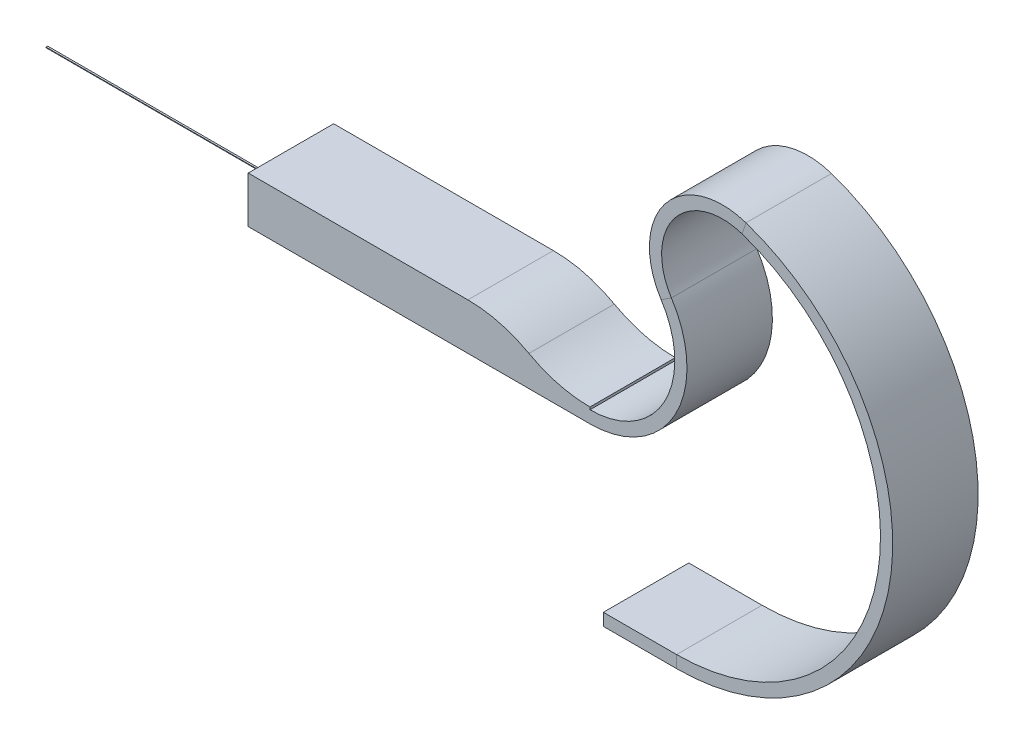
ISO-10303-21;
HEADER;
FILE_DESCRIPTION(('STEP AP214'),'2;1');
FILE_NAME('part.step','',(''),(''),'','','');
FILE_SCHEMA(('AUTOMOTIVE_DESIGN { 1 0 10303 214 1 1 1 1 }'));
ENDSEC;
DATA;
#1=APPLICATION_CONTEXT('core data for automotive mechanical design processes');
#2=APPLICATION_PROTOCOL_DEFINITION('international standard','automotive_design',2000,#1);
#3=PRODUCT_CONTEXT('',#1,'mechanical');
#4=PRODUCT('Part','Part','',(#3));
#5=PRODUCT_RELATED_PRODUCT_CATEGORY('part','',(#4));
#6=PRODUCT_DEFINITION_FORMATION('','',#4);
#7=PRODUCT_DEFINITION_CONTEXT('part definition',#1,'design');
#8=PRODUCT_DEFINITION('design','',#6,#7);
#9=PRODUCT_DEFINITION_SHAPE('','',#8);
#10=(LENGTH_UNIT() NAMED_UNIT(*) SI_UNIT(.MILLI.,.METRE.));
#11=(NAMED_UNIT(*) PLANE_ANGLE_UNIT() SI_UNIT($,.RADIAN.));
#12=(NAMED_UNIT(*) SI_UNIT($,.STERADIAN.) SOLID_ANGLE_UNIT());
#13=UNCERTAINTY_MEASURE_WITH_UNIT(LENGTH_MEASURE(1.E-05),#10,'distance_accuracy_value','');
#14=(GEOMETRIC_REPRESENTATION_CONTEXT(3) GLOBAL_UNCERTAINTY_ASSIGNED_CONTEXT((#13)) GLOBAL_UNIT_ASSIGNED_CONTEXT((#10,
#11,#12)) REPRESENTATION_CONTEXT('',''));
#15=CARTESIAN_POINT('',(0.,0.,0.));
#16=DIRECTION('',(0.,0.,1.));
#17=DIRECTION('',(1.,0.,0.));
#18=AXIS2_PLACEMENT_3D('',#15,#16,#17);
#19=CARTESIAN_POINT('',(7.,1.9,1.75));
#20=DIRECTION('',(-1.,0.,0.));
#21=DIRECTION('',(0.,0.,1.));
#22=AXIS2_PLACEMENT_3D('',#19,#20,#21);
#23=PLANE('',#22);
#24=DIRECTION('',(0.,0.,1.));
#25=VECTOR('',#24,1.);
#26=CARTESIAN_POINT('',(7.,0.5,-1.75));
#27=LINE('',#26,#25);
#28=CARTESIAN_POINT('',(7.,0.5,-1.75));
#29=VERTEX_POINT('',#28);
#30=CARTESIAN_POINT('',(7.,0.5,1.75));
#31=VERTEX_POINT('',#30);
#32=EDGE_CURVE('E53',#29,#31,#27,.T.);
#33=ORIENTED_EDGE('',*,*,#32,.F.);
#34=DIRECTION('',(0.,-1.,0.));
#35=VECTOR('',#34,1.);
#36=CARTESIAN_POINT('',(7.,1.9,-1.75));
#37=LINE('',#36,#35);
#38=CARTESIAN_POINT('',(7.,0.6,-1.75));
#39=VERTEX_POINT('',#38);
#40=EDGE_CURVE('E11',#39,#29,#37,.T.);
#41=ORIENTED_EDGE('',*,*,#40,.F.);
#42=DIRECTION('',(0.,0.,1.));
#43=VECTOR('',#42,1.);
#44=CARTESIAN_POINT('',(7.,0.6,-1.75));
#45=LINE('',#44,#43);
#46=CARTESIAN_POINT('',(7.,0.6,1.75));
#47=VERTEX_POINT('',#46);
#48=EDGE_CURVE('E319',#39,#47,#45,.T.);
#49=ORIENTED_EDGE('',*,*,#48,.T.);
#50=DIRECTION('',(0.,-1.,0.));
#51=VECTOR('',#50,1.);
#52=CARTESIAN_POINT('',(7.,1.9,1.75));
#53=LINE('',#52,#51);
#54=EDGE_CURVE('E334',#47,#31,#53,.T.);
#55=ORIENTED_EDGE('',*,*,#54,.T.);
#56=EDGE_LOOP('',(#33,#41,#49,#55));
#57=FACE_BOUND('',#56,.T.);
#58=ADVANCED_FACE('F39',(#57),#23,.F.);
#59=CARTESIAN_POINT('',(-7.,1.9,1.75));
#60=DIRECTION('',(1.,0.,0.));
#61=DIRECTION('',(0.,0.,-1.));
#62=AXIS2_PLACEMENT_3D('',#59,#60,#61);
#63=PLANE('',#62);
#64=DIRECTION('',(0.,0.,1.));
#65=VECTOR('',#64,1.);
#66=CARTESIAN_POINT('',(-7.,0.,1.75));
#67=LINE('',#66,#65);
#68=CARTESIAN_POINT('',(-7.,0.,-1.75));
#69=VERTEX_POINT('',#68);
#70=CARTESIAN_POINT('',(-7.,0.,1.75));
#71=VERTEX_POINT('',#70);
#72=EDGE_CURVE('E338',#69,#71,#67,.T.);
#73=ORIENTED_EDGE('',*,*,#72,.T.);
#74=DIRECTION('',(0.,-1.,0.));
#75=VECTOR('',#74,1.);
#76=CARTESIAN_POINT('',(-7.,1.9,1.75));
#77=LINE('',#76,#75);
#78=CARTESIAN_POINT('',(-7.,1.9,1.75));
#79=VERTEX_POINT('',#78);
#80=EDGE_CURVE('E342',#79,#71,#77,.T.);
#81=ORIENTED_EDGE('',*,*,#80,.F.);
#82=DIRECTION('',(0.,0.,1.));
#83=VECTOR('',#82,1.);
#84=CARTESIAN_POINT('',(-7.,1.9,1.75));
#85=LINE('',#84,#83);
#86=CARTESIAN_POINT('',(-7.,1.9,-1.75));
#87=VERTEX_POINT('',#86);
#88=EDGE_CURVE('E328',#87,#79,#85,.T.);
#89=ORIENTED_EDGE('',*,*,#88,.F.);
#90=DIRECTION('',(0.,-1.,0.));
#91=VECTOR('',#90,1.);
#92=CARTESIAN_POINT('',(-7.,1.9,-1.75));
#93=LINE('',#92,#91);
#94=EDGE_CURVE('E46',#87,#69,#93,.T.);
#95=ORIENTED_EDGE('',*,*,#94,.T.);
#96=EDGE_LOOP('',(#73,#81,#89,#95));
#97=FACE_BOUND('',#96,.T.);
#98=DIRECTION('',(0.,1.,0.));
#99=VECTOR('',#98,1.);
#100=CARTESIAN_POINT('',(-7.,0.488,0.0349999999999996));
#101=LINE('',#100,#99);
#102=CARTESIAN_POINT('',(-7.,0.488,0.0349999999999996));
#103=VERTEX_POINT('',#102);
#104=CARTESIAN_POINT('',(-7.,0.512,0.0349999999999997));
#105=VERTEX_POINT('',#104);
#106=EDGE_CURVE('E279',#103,#105,#101,.T.);
#107=ORIENTED_EDGE('',*,*,#106,.F.);
#108=DIRECTION('',(0.,0.,1.));
#109=VECTOR('',#108,1.);
#110=CARTESIAN_POINT('',(-7.,0.488,-0.0350000000000004));
#111=LINE('',#110,#109);
#112=CARTESIAN_POINT('',(-7.,0.488,-0.0350000000000005));
#113=VERTEX_POINT('',#112);
#114=EDGE_CURVE('E284',#113,#103,#111,.T.);
#115=ORIENTED_EDGE('',*,*,#114,.F.);
#116=DIRECTION('',(0.,-1.,0.));
#117=VECTOR('',#116,1.);
#118=CARTESIAN_POINT('',(-7.,0.488,-0.0350000000000004));
#119=LINE('',#118,#117);
#120=CARTESIAN_POINT('',(-7.,0.512,-0.0350000000000004));
#121=VERTEX_POINT('',#120);
#122=EDGE_CURVE('E294',#121,#113,#119,.T.);
#123=ORIENTED_EDGE('',*,*,#122,.F.);
#124=DIRECTION('',(0.,0.,-1.));
#125=VECTOR('',#124,1.);
#126=CARTESIAN_POINT('',(-7.,0.512,-0.0350000000000004));
#127=LINE('',#126,#125);
#128=EDGE_CURVE('E60',#105,#121,#127,.T.);
#129=ORIENTED_EDGE('',*,*,#128,.F.);
#130=EDGE_LOOP('',(#107,#115,#123,#129));
#131=FACE_BOUND('',#130,.T.);
#132=ADVANCED_FACE('F349',(#97,#131),#63,.F.);
#133=CARTESIAN_POINT('',(-7.,1.9,-1.75));
#134=DIRECTION('',(0.,0.,1.));
#135=DIRECTION('',(1.,0.,0.));
#136=AXIS2_PLACEMENT_3D('',#133,#134,#135);
#137=PLANE('',#136);
#138=CARTESIAN_POINT('',(2.,-3.23269230769231,-1.75));
#139=DIRECTION('',(0.,0.,-1.));
#140=DIRECTION('',(-1.,0.,0.));
#141=AXIS2_PLACEMENT_3D('',#138,#139,#140);
#142=CIRCLE('',#141,5.13269230769231);
#143=CARTESIAN_POINT('',(2.,1.9,-1.75));
#144=VERTEX_POINT('',#143);
#145=CARTESIAN_POINT('',(4.5,1.25,-1.75));
#146=VERTEX_POINT('',#145);
#147=EDGE_CURVE('E317',#144,#146,#142,.T.);
#148=ORIENTED_EDGE('',*,*,#147,.T.);
#149=CARTESIAN_POINT('',(7.,5.73269230769231,-1.75));
#150=DIRECTION('',(0.,0.,1.));
#151=DIRECTION('',(1.,0.,0.));
#152=AXIS2_PLACEMENT_3D('',#149,#150,#151);
#153=CIRCLE('',#152,5.13269230769231);
#154=EDGE_CURVE('E314',#146,#39,#153,.T.);
#155=ORIENTED_EDGE('',*,*,#154,.T.);
#156=ORIENTED_EDGE('',*,*,#40,.T.);
#157=CARTESIAN_POINT('',(7.,3.97544201821203,-1.75));
#158=DIRECTION('',(0.,0.,1.));
#159=DIRECTION('',(0.,-1.,0.));
#160=AXIS2_PLACEMENT_3D('',#157,#158,#159);
#161=CIRCLE('',#160,3.47544201821203);
#162=CARTESIAN_POINT('',(9.91698375260048,5.86486071427136,-1.75));
#163=VERTEX_POINT('',#162);
#164=EDGE_CURVE('E199',#29,#163,#161,.T.);
#165=ORIENTED_EDGE('',*,*,#164,.T.);
#166=DIRECTION('',(-0.8393130247361,-0.543648458572576,0.));
#167=VECTOR('',#166,1.);
#168=CARTESIAN_POINT('',(10.3366402649685,6.13668494355765,-1.75));
#169=LINE('',#168,#167);
#170=CARTESIAN_POINT('',(10.3366402649685,6.13668494355765,-1.75));
#171=VERTEX_POINT('',#170);
#172=EDGE_CURVE('E175',#171,#163,#169,.T.);
#173=ORIENTED_EDGE('',*,*,#172,.F.);
#174=CARTESIAN_POINT('',(7.,3.97544201821203,-1.75));
#175=DIRECTION('',(0.,0.,1.));
#176=DIRECTION('',(0.,-1.,0.));
#177=AXIS2_PLACEMENT_3D('',#174,#175,#176);
#178=CIRCLE('',#177,3.97544201821203);
#179=CARTESIAN_POINT('',(7.,0.,-1.75));
#180=VERTEX_POINT('',#179);
#181=EDGE_CURVE('E197',#180,#171,#178,.T.);
#182=ORIENTED_EDGE('',*,*,#181,.F.);
#183=DIRECTION('',(-1.,0.,0.));
#184=VECTOR('',#183,1.);
#185=CARTESIAN_POINT('',(-7.,0.,-1.75));
#186=LINE('',#185,#184);
#187=EDGE_CURVE('E336',#180,#69,#186,.T.);
#188=ORIENTED_EDGE('',*,*,#187,.T.);
#189=ORIENTED_EDGE('',*,*,#94,.F.);
#190=DIRECTION('',(-1.,0.,0.));
#191=VECTOR('',#190,1.);
#192=CARTESIAN_POINT('',(-7.,1.9,-1.75));
#193=LINE('',#192,#191);
#194=EDGE_CURVE('E326',#144,#87,#193,.T.);
#195=ORIENTED_EDGE('',*,*,#194,.F.);
#196=EDGE_LOOP('',(#148,#155,#156,#165,#173,#182,#188,#189,#195));
#197=FACE_BOUND('',#196,.T.);
#198=ADVANCED_FACE('F196',(#197),#137,.F.);
#199=CARTESIAN_POINT('',(-7.,1.9,1.75));
#200=DIRECTION('',(0.,0.,-1.));
#201=DIRECTION('',(-1.,0.,0.));
#202=AXIS2_PLACEMENT_3D('',#199,#200,#201);
#203=PLANE('',#202);
#204=ORIENTED_EDGE('',*,*,#54,.F.);
#205=CARTESIAN_POINT('',(7.,5.73269230769231,1.75));
#206=DIRECTION('',(0.,0.,1.));
#207=DIRECTION('',(1.,0.,0.));
#208=AXIS2_PLACEMENT_3D('',#205,#206,#207);
#209=CIRCLE('',#208,5.13269230769231);
#210=CARTESIAN_POINT('',(4.5,1.25,1.75));
#211=VERTEX_POINT('',#210);
#212=EDGE_CURVE('E309',#211,#47,#209,.T.);
#213=ORIENTED_EDGE('',*,*,#212,.F.);
#214=CARTESIAN_POINT('',(2.,-3.23269230769231,1.75));
#215=DIRECTION('',(0.,0.,-1.));
#216=DIRECTION('',(-1.,0.,0.));
#217=AXIS2_PLACEMENT_3D('',#214,#215,#216);
#218=CIRCLE('',#217,5.13269230769231);
#219=CARTESIAN_POINT('',(2.,1.9,1.75));
#220=VERTEX_POINT('',#219);
#221=EDGE_CURVE('E311',#220,#211,#218,.T.);
#222=ORIENTED_EDGE('',*,*,#221,.F.);
#223=DIRECTION('',(1.,0.,0.));
#224=VECTOR('',#223,1.);
#225=CARTESIAN_POINT('',(-7.,1.9,1.75));
#226=LINE('',#225,#224);
#227=EDGE_CURVE('E331',#79,#220,#226,.T.);
#228=ORIENTED_EDGE('',*,*,#227,.F.);
#229=ORIENTED_EDGE('',*,*,#80,.T.);
#230=DIRECTION('',(1.,0.,0.));
#231=VECTOR('',#230,1.);
#232=CARTESIAN_POINT('',(-7.,0.,1.75));
#233=LINE('',#232,#231);
#234=CARTESIAN_POINT('',(7.,0.,1.75));
#235=VERTEX_POINT('',#234);
#236=EDGE_CURVE('E329',#71,#235,#233,.T.);
#237=ORIENTED_EDGE('',*,*,#236,.T.);
#238=CARTESIAN_POINT('',(7.,3.97544201821203,1.75));
#239=DIRECTION('',(0.,0.,1.));
#240=DIRECTION('',(0.,-1.,0.));
#241=AXIS2_PLACEMENT_3D('',#238,#239,#240);
#242=CIRCLE('',#241,3.97544201821203);
#243=CARTESIAN_POINT('',(10.3366402649685,6.13668494355765,1.75));
#244=VERTEX_POINT('',#243);
#245=EDGE_CURVE('E190',#235,#244,#242,.T.);
#246=ORIENTED_EDGE('',*,*,#245,.T.);
#247=DIRECTION('',(0.8393130247361,0.543648458572576,0.));
#248=VECTOR('',#247,1.);
#249=CARTESIAN_POINT('',(10.3366402649685,6.13668494355765,1.75));
#250=LINE('',#249,#248);
#251=CARTESIAN_POINT('',(9.91698375260048,5.86486071427136,1.75));
#252=VERTEX_POINT('',#251);
#253=EDGE_CURVE('E240',#252,#244,#250,.T.);
#254=ORIENTED_EDGE('',*,*,#253,.F.);
#255=CARTESIAN_POINT('',(7.,3.97544201821203,1.75));
#256=DIRECTION('',(0.,0.,1.));
#257=DIRECTION('',(0.,-1.,0.));
#258=AXIS2_PLACEMENT_3D('',#255,#256,#257);
#259=CIRCLE('',#258,3.47544201821203);
#260=EDGE_CURVE('E237',#31,#252,#259,.T.);
#261=ORIENTED_EDGE('',*,*,#260,.F.);
#262=EDGE_LOOP('',(#204,#213,#222,#228,#229,#237,#246,#254,#261));
#263=FACE_BOUND('',#262,.T.);
#264=ADVANCED_FACE('F357',(#263),#203,.F.);
#265=CARTESIAN_POINT('',(0.,1.9,0.));
#266=DIRECTION('',(0.,-1.,0.));
#267=DIRECTION('',(0.,0.,-1.));
#268=AXIS2_PLACEMENT_3D('',#265,#266,#267);
#269=PLANE('',#268);
#270=ORIENTED_EDGE('',*,*,#227,.T.);
#271=DIRECTION('',(0.,0.,1.));
#272=VECTOR('',#271,1.);
#273=CARTESIAN_POINT('',(2.,1.9,-1.75));
#274=LINE('',#273,#272);
#275=EDGE_CURVE('E322',#144,#220,#274,.T.);
#276=ORIENTED_EDGE('',*,*,#275,.F.);
#277=ORIENTED_EDGE('',*,*,#194,.T.);
#278=ORIENTED_EDGE('',*,*,#88,.T.);
#279=EDGE_LOOP('',(#270,#276,#277,#278));
#280=FACE_BOUND('',#279,.T.);
#281=ADVANCED_FACE('F364',(#280),#269,.F.);
#282=CARTESIAN_POINT('',(0.,0.,0.));
#283=DIRECTION('',(0.,-1.,0.));
#284=DIRECTION('',(0.,0.,-1.));
#285=AXIS2_PLACEMENT_3D('',#282,#283,#284);
#286=PLANE('',#285);
#287=DIRECTION('',(0.,0.,-1.));
#288=VECTOR('',#287,1.);
#289=CARTESIAN_POINT('',(7.,0.,1.75));
#290=LINE('',#289,#288);
#291=EDGE_CURVE('E204',#235,#180,#290,.T.);
#292=ORIENTED_EDGE('',*,*,#291,.F.);
#293=ORIENTED_EDGE('',*,*,#236,.F.);
#294=ORIENTED_EDGE('',*,*,#72,.F.);
#295=ORIENTED_EDGE('',*,*,#187,.F.);
#296=EDGE_LOOP('',(#292,#293,#294,#295));
#297=FACE_BOUND('',#296,.T.);
#298=ADVANCED_FACE('F354',(#297),#286,.T.);
#299=CARTESIAN_POINT('',(7.,5.73269230769231,-1.75));
#300=DIRECTION('',(0.,0.,1.));
#301=DIRECTION('',(1.,0.,0.));
#302=AXIS2_PLACEMENT_3D('',#299,#300,#301);
#303=CYLINDRICAL_SURFACE('',#302,5.13269230769231);
#304=ORIENTED_EDGE('',*,*,#48,.F.);
#305=ORIENTED_EDGE('',*,*,#154,.F.);
#306=DIRECTION('',(0.,0.,1.));
#307=VECTOR('',#306,1.);
#308=CARTESIAN_POINT('',(4.5,1.25,-1.75));
#309=LINE('',#308,#307);
#310=EDGE_CURVE('E320',#146,#211,#309,.T.);
#311=ORIENTED_EDGE('',*,*,#310,.T.);
#312=ORIENTED_EDGE('',*,*,#212,.T.);
#313=EDGE_LOOP('',(#304,#305,#311,#312));
#314=FACE_BOUND('',#313,.T.);
#315=ADVANCED_FACE('F369',(#314),#303,.F.);
#316=CARTESIAN_POINT('',(2.,-3.23269230769231,-1.75));
#317=DIRECTION('',(0.,0.,1.));
#318=DIRECTION('',(1.,0.,0.));
#319=AXIS2_PLACEMENT_3D('',#316,#317,#318);
#320=CYLINDRICAL_SURFACE('',#319,5.13269230769231);
#321=ORIENTED_EDGE('',*,*,#310,.F.);
#322=ORIENTED_EDGE('',*,*,#147,.F.);
#323=ORIENTED_EDGE('',*,*,#275,.T.);
#324=ORIENTED_EDGE('',*,*,#221,.T.);
#325=EDGE_LOOP('',(#321,#322,#323,#324));
#326=FACE_BOUND('',#325,.T.);
#327=ADVANCED_FACE('F367',(#326),#320,.T.);
#328=CARTESIAN_POINT('',(-17.,0.488,0.0349999999999996));
#329=DIRECTION('',(0.,0.,-1.));
#330=DIRECTION('',(0.,1.,0.));
#331=AXIS2_PLACEMENT_3D('',#328,#329,#330);
#332=PLANE('',#331);
#333=ORIENTED_EDGE('',*,*,#106,.T.);
#334=DIRECTION('',(1.,0.,0.));
#335=VECTOR('',#334,1.);
#336=CARTESIAN_POINT('',(-17.,0.512,0.0349999999999996));
#337=LINE('',#336,#335);
#338=CARTESIAN_POINT('',(-17.,0.512,0.0349999999999996));
#339=VERTEX_POINT('',#338);
#340=EDGE_CURVE('E307',#339,#105,#337,.T.);
#341=ORIENTED_EDGE('',*,*,#340,.F.);
#342=DIRECTION('',(0.,1.,0.));
#343=VECTOR('',#342,1.);
#344=CARTESIAN_POINT('',(-17.,0.488,0.0349999999999996));
#345=LINE('',#344,#343);
#346=CARTESIAN_POINT('',(-17.,0.488,0.0349999999999996));
#347=VERTEX_POINT('',#346);
#348=EDGE_CURVE('E280',#347,#339,#345,.T.);
#349=ORIENTED_EDGE('',*,*,#348,.F.);
#350=DIRECTION('',(1.,0.,0.));
#351=VECTOR('',#350,1.);
#352=CARTESIAN_POINT('',(-17.,0.488,0.0349999999999996));
#353=LINE('',#352,#351);
#354=EDGE_CURVE('E290',#347,#103,#353,.T.);
#355=ORIENTED_EDGE('',*,*,#354,.T.);
#356=EDGE_LOOP('',(#333,#341,#349,#355));
#357=FACE_BOUND('',#356,.T.);
#358=ADVANCED_FACE('F437',(#357),#332,.F.);
#359=CARTESIAN_POINT('',(-17.,0.512,-0.0350000000000004));
#360=DIRECTION('',(0.,-1.,0.));
#361=DIRECTION('',(0.,0.,-1.));
#362=AXIS2_PLACEMENT_3D('',#359,#360,#361);
#363=PLANE('',#362);
#364=ORIENTED_EDGE('',*,*,#128,.T.);
#365=DIRECTION('',(1.,0.,0.));
#366=VECTOR('',#365,1.);
#367=CARTESIAN_POINT('',(-17.,0.512,-0.0350000000000004));
#368=LINE('',#367,#366);
#369=CARTESIAN_POINT('',(-17.,0.512,-0.0350000000000004));
#370=VERTEX_POINT('',#369);
#371=EDGE_CURVE('E304',#370,#121,#368,.T.);
#372=ORIENTED_EDGE('',*,*,#371,.F.);
#373=DIRECTION('',(0.,0.,-1.));
#374=VECTOR('',#373,1.);
#375=CARTESIAN_POINT('',(-17.,0.512,-0.0350000000000004));
#376=LINE('',#375,#374);
#377=EDGE_CURVE('E283',#339,#370,#376,.T.);
#378=ORIENTED_EDGE('',*,*,#377,.F.);
#379=ORIENTED_EDGE('',*,*,#340,.T.);
#380=EDGE_LOOP('',(#364,#372,#378,#379));
#381=FACE_BOUND('',#380,.T.);
#382=ADVANCED_FACE('F440',(#381),#363,.F.);
#383=CARTESIAN_POINT('',(-17.,0.488,-0.0350000000000004));
#384=DIRECTION('',(0.,0.,1.));
#385=DIRECTION('',(0.,-1.,0.));
#386=AXIS2_PLACEMENT_3D('',#383,#384,#385);
#387=PLANE('',#386);
#388=ORIENTED_EDGE('',*,*,#122,.T.);
#389=DIRECTION('',(1.,0.,0.));
#390=VECTOR('',#389,1.);
#391=CARTESIAN_POINT('',(-17.,0.488,-0.0350000000000004));
#392=LINE('',#391,#390);
#393=CARTESIAN_POINT('',(-17.,0.488,-0.0350000000000004));
#394=VERTEX_POINT('',#393);
#395=EDGE_CURVE('E301',#394,#113,#392,.T.);
#396=ORIENTED_EDGE('',*,*,#395,.F.);
#397=DIRECTION('',(0.,-1.,0.));
#398=VECTOR('',#397,1.);
#399=CARTESIAN_POINT('',(-17.,0.488,-0.0350000000000004));
#400=LINE('',#399,#398);
#401=EDGE_CURVE('E286',#370,#394,#400,.T.);
#402=ORIENTED_EDGE('',*,*,#401,.F.);
#403=ORIENTED_EDGE('',*,*,#371,.T.);
#404=EDGE_LOOP('',(#388,#396,#402,#403));
#405=FACE_BOUND('',#404,.T.);
#406=ADVANCED_FACE('F444',(#405),#387,.F.);
#407=CARTESIAN_POINT('',(-17.,0.488,-0.0350000000000004));
#408=DIRECTION('',(0.,1.,0.));
#409=DIRECTION('',(0.,0.,1.));
#410=AXIS2_PLACEMENT_3D('',#407,#408,#409);
#411=PLANE('',#410);
#412=ORIENTED_EDGE('',*,*,#114,.T.);
#413=ORIENTED_EDGE('',*,*,#354,.F.);
#414=DIRECTION('',(0.,0.,1.));
#415=VECTOR('',#414,1.);
#416=CARTESIAN_POINT('',(-17.,0.488,-0.0350000000000004));
#417=LINE('',#416,#415);
#418=EDGE_CURVE('E288',#394,#347,#417,.T.);
#419=ORIENTED_EDGE('',*,*,#418,.F.);
#420=ORIENTED_EDGE('',*,*,#395,.T.);
#421=EDGE_LOOP('',(#412,#413,#419,#420));
#422=FACE_BOUND('',#421,.T.);
#423=ADVANCED_FACE('F414',(#422),#411,.F.);
#424=CARTESIAN_POINT('',(-17.,0.,0.));
#425=DIRECTION('',(1.,0.,0.));
#426=DIRECTION('',(0.,0.,-1.));
#427=AXIS2_PLACEMENT_3D('',#424,#425,#426);
#428=PLANE('',#427);
#429=ORIENTED_EDGE('',*,*,#348,.T.);
#430=ORIENTED_EDGE('',*,*,#377,.T.);
#431=ORIENTED_EDGE('',*,*,#401,.T.);
#432=ORIENTED_EDGE('',*,*,#418,.T.);
#433=EDGE_LOOP('',(#429,#430,#431,#432));
#434=FACE_BOUND('',#433,.T.);
#435=ADVANCED_FACE('F407',(#434),#428,.F.);
#436=CARTESIAN_POINT('',(7.5491408820767,-6.40960178921661,0.));
#437=DIRECTION('',(-1.,0.,0.));
#438=DIRECTION('',(0.,0.,-1.));
#439=AXIS2_PLACEMENT_3D('',#436,#437,#438);
#440=PLANE('',#439);
#441=DIRECTION('',(0.,-1.,0.));
#442=VECTOR('',#441,1.);
#443=CARTESIAN_POINT('',(7.5491408820767,-6.40960178921661,-1.75));
#444=LINE('',#443,#442);
#445=CARTESIAN_POINT('',(7.5491408820767,-6.40960178921661,-1.75));
#446=VERTEX_POINT('',#445);
#447=CARTESIAN_POINT('',(7.5491408820767,-6.90960178921661,-1.75));
#448=VERTEX_POINT('',#447);
#449=EDGE_CURVE('E224',#446,#448,#444,.T.);
#450=ORIENTED_EDGE('',*,*,#449,.T.);
#451=DIRECTION('',(0.,0.,1.));
#452=VECTOR('',#451,1.);
#453=CARTESIAN_POINT('',(7.5491408820767,-6.90960178921661,-1.75));
#454=LINE('',#453,#452);
#455=CARTESIAN_POINT('',(7.5491408820767,-6.90960178921661,1.75));
#456=VERTEX_POINT('',#455);
#457=EDGE_CURVE('E230',#448,#456,#454,.T.);
#458=ORIENTED_EDGE('',*,*,#457,.T.);
#459=DIRECTION('',(0.,1.,0.));
#460=VECTOR('',#459,1.);
#461=CARTESIAN_POINT('',(7.5491408820767,-6.40960178921661,1.75));
#462=LINE('',#461,#460);
#463=CARTESIAN_POINT('',(7.5491408820767,-6.40960178921661,1.75));
#464=VERTEX_POINT('',#463);
#465=EDGE_CURVE('E257',#456,#464,#462,.T.);
#466=ORIENTED_EDGE('',*,*,#465,.T.);
#467=DIRECTION('',(0.,0.,-1.));
#468=VECTOR('',#467,1.);
#469=CARTESIAN_POINT('',(7.5491408820767,-6.40960178921661,-1.75));
#470=LINE('',#469,#468);
#471=EDGE_CURVE('E272',#464,#446,#470,.T.);
#472=ORIENTED_EDGE('',*,*,#471,.T.);
#473=EDGE_LOOP('',(#450,#458,#466,#472));
#474=FACE_BOUND('',#473,.T.);
#475=ADVANCED_FACE('F405',(#474),#440,.T.);
#476=CARTESIAN_POINT('',(7.,3.97544201821203,0.));
#477=DIRECTION('',(0.,0.,1.));
#478=DIRECTION('',(1.,0.,0.));
#479=AXIS2_PLACEMENT_3D('',#476,#477,#478);
#480=CYLINDRICAL_SURFACE('',#479,3.47544201821203);
#481=ORIENTED_EDGE('',*,*,#260,.T.);
#482=DIRECTION('',(0.,0.,1.));
#483=VECTOR('',#482,1.);
#484=CARTESIAN_POINT('',(9.91698375260048,5.86486071427136,-1.75));
#485=LINE('',#484,#483);
#486=EDGE_CURVE('E234',#163,#252,#485,.T.);
#487=ORIENTED_EDGE('',*,*,#486,.F.);
#488=ORIENTED_EDGE('',*,*,#164,.F.);
#489=ORIENTED_EDGE('',*,*,#32,.T.);
#490=EDGE_LOOP('',(#481,#487,#488,#489));
#491=FACE_BOUND('',#490,.T.);
#492=ADVANCED_FACE('F373',(#491),#480,.F.);
#493=CARTESIAN_POINT('',(7.,3.97544201821203,0.));
#494=DIRECTION('',(0.,0.,1.));
#495=DIRECTION('',(1.,0.,0.));
#496=AXIS2_PLACEMENT_3D('',#493,#494,#495);
#497=CYLINDRICAL_SURFACE('',#496,3.97544201821203);
#498=DIRECTION('',(0.,0.,-1.));
#499=VECTOR('',#498,1.);
#500=CARTESIAN_POINT('',(10.3366402649685,6.13668494355765,-1.75));
#501=LINE('',#500,#499);
#502=EDGE_CURVE('E180',#244,#171,#501,.T.);
#503=ORIENTED_EDGE('',*,*,#502,.F.);
#504=ORIENTED_EDGE('',*,*,#245,.F.);
#505=ORIENTED_EDGE('',*,*,#291,.T.);
#506=ORIENTED_EDGE('',*,*,#181,.T.);
#507=EDGE_LOOP('',(#503,#504,#505,#506));
#508=FACE_BOUND('',#507,.T.);
#509=ADVANCED_FACE('F202',(#508),#497,.T.);
#510=CARTESIAN_POINT('',(10.3366402649692,6.13668494355811,-1.75));
#511=DIRECTION('',(0.,0.,-1.));
#512=DIRECTION('',(-1.,0.,0.));
#513=AXIS2_PLACEMENT_3D('',#510,#511,#512);
#514=PLANE('',#513);
#515=CARTESIAN_POINT('',(12.4312110831097,7.4934018812122,-1.75));
#516=DIRECTION('',(0.,0.,-1.));
#517=DIRECTION('',(-0.8393130247361,-0.543648458572576,0.));
#518=AXIS2_PLACEMENT_3D('',#515,#516,#517);
#519=CIRCLE('',#518,2.99557764077238);
#520=CARTESIAN_POINT('',(13.3934768804341,10.330218748265,-1.75));
#521=VERTEX_POINT('',#520);
#522=EDGE_CURVE('E210',#163,#521,#519,.T.);
#523=ORIENTED_EDGE('',*,*,#522,.T.);
#524=DIRECTION('',(0.321228795484086,0.947001616129478,0.));
#525=VECTOR('',#524,1.);
#526=CARTESIAN_POINT('',(13.232862482692,9.85671794020024,-1.75));
#527=LINE('',#526,#525);
#528=CARTESIAN_POINT('',(13.232862482692,9.85671794020024,-1.75));
#529=VERTEX_POINT('',#528);
#530=EDGE_CURVE('E177',#529,#521,#527,.T.);
#531=ORIENTED_EDGE('',*,*,#530,.F.);
#532=CARTESIAN_POINT('',(12.4312110831097,7.4934018812122,-1.75));
#533=DIRECTION('',(0.,0.,-1.));
#534=DIRECTION('',(-0.8393130247361,-0.543648458572576,0.));
#535=AXIS2_PLACEMENT_3D('',#532,#533,#534);
#536=CIRCLE('',#535,2.49557764077238);
#537=EDGE_CURVE('E170',#171,#529,#536,.T.);
#538=ORIENTED_EDGE('',*,*,#537,.F.);
#539=ORIENTED_EDGE('',*,*,#172,.T.);
#540=EDGE_LOOP('',(#523,#531,#538,#539));
#541=FACE_BOUND('',#540,.T.);
#542=ADVANCED_FACE('F173',(#541),#514,.T.);
#543=CARTESIAN_POINT('',(12.4312110831097,7.4934018812122,0.));
#544=DIRECTION('',(0.,0.,-1.));
#545=DIRECTION('',(-1.,0.,0.));
#546=AXIS2_PLACEMENT_3D('',#543,#544,#545);
#547=CYLINDRICAL_SURFACE('',#546,2.99557764077238);
#548=CARTESIAN_POINT('',(12.4312110831097,7.4934018812122,1.75));
#549=DIRECTION('',(0.,0.,-1.));
#550=DIRECTION('',(-0.8393130247361,-0.543648458572576,0.));
#551=AXIS2_PLACEMENT_3D('',#548,#549,#550);
#552=CIRCLE('',#551,2.99557764077238);
#553=CARTESIAN_POINT('',(13.3934768804341,10.330218748265,1.75));
#554=VERTEX_POINT('',#553);
#555=EDGE_CURVE('E243',#252,#554,#552,.T.);
#556=ORIENTED_EDGE('',*,*,#555,.T.);
#557=DIRECTION('',(0.,0.,1.));
#558=VECTOR('',#557,1.);
#559=CARTESIAN_POINT('',(13.3934768804341,10.330218748265,-1.75));
#560=LINE('',#559,#558);
#561=EDGE_CURVE('E211',#521,#554,#560,.T.);
#562=ORIENTED_EDGE('',*,*,#561,.F.);
#563=ORIENTED_EDGE('',*,*,#522,.F.);
#564=ORIENTED_EDGE('',*,*,#486,.T.);
#565=EDGE_LOOP('',(#556,#562,#563,#564));
#566=FACE_BOUND('',#565,.T.);
#567=ADVANCED_FACE('F375',(#566),#547,.T.);
#568=CARTESIAN_POINT('',(10.3366402649692,6.13668494355811,1.75));
#569=DIRECTION('',(0.,0.,1.));
#570=DIRECTION('',(1.,0.,0.));
#571=AXIS2_PLACEMENT_3D('',#568,#569,#570);
#572=PLANE('',#571);
#573=CARTESIAN_POINT('',(12.4312110831097,7.4934018812122,1.75));
#574=DIRECTION('',(0.,0.,-1.));
#575=DIRECTION('',(-0.8393130247361,-0.543648458572576,0.));
#576=AXIS2_PLACEMENT_3D('',#573,#574,#575);
#577=CIRCLE('',#576,2.49557764077238);
#578=CARTESIAN_POINT('',(13.232862482692,9.85671794020024,1.75));
#579=VERTEX_POINT('',#578);
#580=EDGE_CURVE('E185',#244,#579,#577,.T.);
#581=ORIENTED_EDGE('',*,*,#580,.T.);
#582=DIRECTION('',(-0.321228795484086,-0.947001616129478,0.));
#583=VECTOR('',#582,1.);
#584=CARTESIAN_POINT('',(13.232862482692,9.85671794020024,1.75));
#585=LINE('',#584,#583);
#586=EDGE_CURVE('E246',#554,#579,#585,.T.);
#587=ORIENTED_EDGE('',*,*,#586,.F.);
#588=ORIENTED_EDGE('',*,*,#555,.F.);
#589=ORIENTED_EDGE('',*,*,#253,.T.);
#590=EDGE_LOOP('',(#581,#587,#588,#589));
#591=FACE_BOUND('',#590,.T.);
#592=ADVANCED_FACE('F385',(#591),#572,.T.);
#593=CARTESIAN_POINT('',(12.4312110831097,7.4934018812122,0.));
#594=DIRECTION('',(0.,0.,-1.));
#595=DIRECTION('',(-1.,0.,0.));
#596=AXIS2_PLACEMENT_3D('',#593,#594,#595);
#597=CYLINDRICAL_SURFACE('',#596,2.49557764077238);
#598=DIRECTION('',(0.,0.,-1.));
#599=VECTOR('',#598,1.);
#600=CARTESIAN_POINT('',(13.232862482692,9.85671794020024,-1.75));
#601=LINE('',#600,#599);
#602=EDGE_CURVE('E223',#579,#529,#601,.T.);
#603=ORIENTED_EDGE('',*,*,#602,.F.);
#604=ORIENTED_EDGE('',*,*,#580,.F.);
#605=ORIENTED_EDGE('',*,*,#502,.T.);
#606=ORIENTED_EDGE('',*,*,#537,.T.);
#607=EDGE_LOOP('',(#603,#604,#605,#606));
#608=FACE_BOUND('',#607,.T.);
#609=ADVANCED_FACE('F183',(#608),#597,.F.);
#610=CARTESIAN_POINT('',(13.232862482692,9.85671794020024,-1.75));
#611=DIRECTION('',(0.,0.,-1.));
#612=DIRECTION('',(-1.,0.,0.));
#613=AXIS2_PLACEMENT_3D('',#610,#611,#612);
#614=PLANE('',#613);
#615=CARTESIAN_POINT('',(10.5491408820767,1.94494686378005,-1.75));
#616=DIRECTION('',(0.,0.,-1.));
#617=DIRECTION('',(0.321228795484086,0.947001616129478,0.));
#618=AXIS2_PLACEMENT_3D('',#615,#616,#617);
#619=CIRCLE('',#618,8.85454865299666);
#620=CARTESIAN_POINT('',(10.5491408820767,-6.90960178921661,-1.75));
#621=VERTEX_POINT('',#620);
#622=EDGE_CURVE('E216',#521,#621,#619,.T.);
#623=ORIENTED_EDGE('',*,*,#622,.T.);
#624=DIRECTION('',(0.,-1.,0.));
#625=VECTOR('',#624,1.);
#626=CARTESIAN_POINT('',(10.5491408820767,-6.40960178921661,-1.75));
#627=LINE('',#626,#625);
#628=CARTESIAN_POINT('',(10.5491408820767,-6.40960178921661,-1.75));
#629=VERTEX_POINT('',#628);
#630=EDGE_CURVE('E213',#629,#621,#627,.T.);
#631=ORIENTED_EDGE('',*,*,#630,.F.);
#632=CARTESIAN_POINT('',(10.5491408820767,1.94494686378005,-1.75));
#633=DIRECTION('',(0.,0.,-1.));
#634=DIRECTION('',(0.321228795484086,0.947001616129478,0.));
#635=AXIS2_PLACEMENT_3D('',#632,#633,#634);
#636=CIRCLE('',#635,8.35454865299666);
#637=EDGE_CURVE('E217',#529,#629,#636,.T.);
#638=ORIENTED_EDGE('',*,*,#637,.F.);
#639=ORIENTED_EDGE('',*,*,#530,.T.);
#640=EDGE_LOOP('',(#623,#631,#638,#639));
#641=FACE_BOUND('',#640,.T.);
#642=ADVANCED_FACE('F378',(#641),#614,.T.);
#643=CARTESIAN_POINT('',(10.5491408820767,1.94494686378005,0.));
#644=DIRECTION('',(0.,0.,-1.));
#645=DIRECTION('',(-1.,0.,0.));
#646=AXIS2_PLACEMENT_3D('',#643,#644,#645);
#647=CYLINDRICAL_SURFACE('',#646,8.85454865299666);
#648=CARTESIAN_POINT('',(10.5491408820767,1.94494686378005,1.75));
#649=DIRECTION('',(0.,0.,-1.));
#650=DIRECTION('',(0.321228795484086,0.947001616129478,0.));
#651=AXIS2_PLACEMENT_3D('',#648,#649,#650);
#652=CIRCLE('',#651,8.85454865299666);
#653=CARTESIAN_POINT('',(10.5491408820767,-6.90960178921661,1.75));
#654=VERTEX_POINT('',#653);
#655=EDGE_CURVE('E249',#554,#654,#652,.T.);
#656=ORIENTED_EDGE('',*,*,#655,.T.);
#657=DIRECTION('',(0.,0.,1.));
#658=VECTOR('',#657,1.);
#659=CARTESIAN_POINT('',(10.5491408820767,-6.90960178921661,-1.75));
#660=LINE('',#659,#658);
#661=EDGE_CURVE('E220',#621,#654,#660,.T.);
#662=ORIENTED_EDGE('',*,*,#661,.F.);
#663=ORIENTED_EDGE('',*,*,#622,.F.);
#664=ORIENTED_EDGE('',*,*,#561,.T.);
#665=EDGE_LOOP('',(#656,#662,#663,#664));
#666=FACE_BOUND('',#665,.T.);
#667=ADVANCED_FACE('F391',(#666),#647,.T.);
#668=CARTESIAN_POINT('',(13.232862482692,9.85671794020024,1.75));
#669=DIRECTION('',(0.,0.,1.));
#670=DIRECTION('',(1.,0.,0.));
#671=AXIS2_PLACEMENT_3D('',#668,#669,#670);
#672=PLANE('',#671);
#673=CARTESIAN_POINT('',(10.5491408820767,1.94494686378005,1.75));
#674=DIRECTION('',(0.,0.,-1.));
#675=DIRECTION('',(0.321228795484086,0.947001616129478,0.));
#676=AXIS2_PLACEMENT_3D('',#673,#674,#675);
#677=CIRCLE('',#676,8.35454865299666);
#678=CARTESIAN_POINT('',(10.5491408820767,-6.40960178921661,1.75));
#679=VERTEX_POINT('',#678);
#680=EDGE_CURVE('E266',#579,#679,#677,.T.);
#681=ORIENTED_EDGE('',*,*,#680,.T.);
#682=DIRECTION('',(0.,1.,0.));
#683=VECTOR('',#682,1.);
#684=CARTESIAN_POINT('',(10.5491408820767,-6.40960178921661,1.75));
#685=LINE('',#684,#683);
#686=EDGE_CURVE('E252',#654,#679,#685,.T.);
#687=ORIENTED_EDGE('',*,*,#686,.F.);
#688=ORIENTED_EDGE('',*,*,#655,.F.);
#689=ORIENTED_EDGE('',*,*,#586,.T.);
#690=EDGE_LOOP('',(#681,#687,#688,#689));
#691=FACE_BOUND('',#690,.T.);
#692=ADVANCED_FACE('F387',(#691),#672,.T.);
#693=CARTESIAN_POINT('',(10.5491408820767,1.94494686378005,0.));
#694=DIRECTION('',(0.,0.,-1.));
#695=DIRECTION('',(-1.,0.,0.));
#696=AXIS2_PLACEMENT_3D('',#693,#694,#695);
#697=CYLINDRICAL_SURFACE('',#696,8.35454865299666);
#698=DIRECTION('',(0.,0.,-1.));
#699=VECTOR('',#698,1.);
#700=CARTESIAN_POINT('',(10.5491408820767,-6.40960178921661,-1.75));
#701=LINE('',#700,#699);
#702=EDGE_CURVE('E232',#679,#629,#701,.T.);
#703=ORIENTED_EDGE('',*,*,#702,.F.);
#704=ORIENTED_EDGE('',*,*,#680,.F.);
#705=ORIENTED_EDGE('',*,*,#602,.T.);
#706=ORIENTED_EDGE('',*,*,#637,.T.);
#707=EDGE_LOOP('',(#703,#704,#705,#706));
#708=FACE_BOUND('',#707,.T.);
#709=ADVANCED_FACE('F382',(#708),#697,.F.);
#710=CARTESIAN_POINT('',(10.5491408820767,-6.40960178921661,-1.75));
#711=DIRECTION('',(0.,0.,-1.));
#712=DIRECTION('',(-1.,0.,0.));
#713=AXIS2_PLACEMENT_3D('',#710,#711,#712);
#714=PLANE('',#713);
#715=DIRECTION('',(-1.,0.,0.));
#716=VECTOR('',#715,1.);
#717=CARTESIAN_POINT('',(10.5491408820767,-6.90960178921661,-1.75));
#718=LINE('',#717,#716);
#719=EDGE_CURVE('E226',#621,#448,#718,.T.);
#720=ORIENTED_EDGE('',*,*,#719,.T.);
#721=ORIENTED_EDGE('',*,*,#449,.F.);
#722=DIRECTION('',(-1.,0.,0.));
#723=VECTOR('',#722,1.);
#724=CARTESIAN_POINT('',(10.5491408820767,-6.40960178921661,-1.75));
#725=LINE('',#724,#723);
#726=EDGE_CURVE('E227',#629,#446,#725,.T.);
#727=ORIENTED_EDGE('',*,*,#726,.F.);
#728=ORIENTED_EDGE('',*,*,#630,.T.);
#729=EDGE_LOOP('',(#720,#721,#727,#728));
#730=FACE_BOUND('',#729,.T.);
#731=ADVANCED_FACE('F397',(#730),#714,.T.);
#732=CARTESIAN_POINT('',(10.5491408820767,-6.90960178921661,-1.75));
#733=DIRECTION('',(0.,-1.,0.));
#734=DIRECTION('',(0.,0.,-1.));
#735=AXIS2_PLACEMENT_3D('',#732,#733,#734);
#736=PLANE('',#735);
#737=DIRECTION('',(-1.,0.,0.));
#738=VECTOR('',#737,1.);
#739=CARTESIAN_POINT('',(10.5491408820767,-6.90960178921661,1.75));
#740=LINE('',#739,#738);
#741=EDGE_CURVE('E254',#654,#456,#740,.T.);
#742=ORIENTED_EDGE('',*,*,#741,.T.);
#743=ORIENTED_EDGE('',*,*,#457,.F.);
#744=ORIENTED_EDGE('',*,*,#719,.F.);
#745=ORIENTED_EDGE('',*,*,#661,.T.);
#746=EDGE_LOOP('',(#742,#743,#744,#745));
#747=FACE_BOUND('',#746,.T.);
#748=ADVANCED_FACE('F393',(#747),#736,.T.);
#749=CARTESIAN_POINT('',(10.5491408820767,-6.40960178921661,1.75));
#750=DIRECTION('',(0.,0.,1.));
#751=DIRECTION('',(1.,0.,0.));
#752=AXIS2_PLACEMENT_3D('',#749,#750,#751);
#753=PLANE('',#752);
#754=DIRECTION('',(-1.,0.,0.));
#755=VECTOR('',#754,1.);
#756=CARTESIAN_POINT('',(10.5491408820767,-6.40960178921661,1.75));
#757=LINE('',#756,#755);
#758=EDGE_CURVE('E270',#679,#464,#757,.T.);
#759=ORIENTED_EDGE('',*,*,#758,.T.);
#760=ORIENTED_EDGE('',*,*,#465,.F.);
#761=ORIENTED_EDGE('',*,*,#741,.F.);
#762=ORIENTED_EDGE('',*,*,#686,.T.);
#763=EDGE_LOOP('',(#759,#760,#761,#762));
#764=FACE_BOUND('',#763,.T.);
#765=ADVANCED_FACE('F403',(#764),#753,.T.);
#766=CARTESIAN_POINT('',(10.5491408820767,-6.40960178921661,-1.75));
#767=DIRECTION('',(0.,1.,0.));
#768=DIRECTION('',(0.,0.,1.));
#769=AXIS2_PLACEMENT_3D('',#766,#767,#768);
#770=PLANE('',#769);
#771=ORIENTED_EDGE('',*,*,#471,.F.);
#772=ORIENTED_EDGE('',*,*,#758,.F.);
#773=ORIENTED_EDGE('',*,*,#702,.T.);
#774=ORIENTED_EDGE('',*,*,#726,.T.);
#775=EDGE_LOOP('',(#771,#772,#773,#774));
#776=FACE_BOUND('',#775,.T.);
#777=ADVANCED_FACE('F400',(#776),#770,.T.);
#778=CLOSED_SHELL('',(#58,#132,#198,#264,#281,#298,#315,#327,#358,#382,#406,#423,#435,#475,#492,
#509,#542,#567,#592,#609,#642,#667,#692,#709,#731,#748,#765,#777));
#779=MANIFOLD_SOLID_BREP('B2',#778);
#780=ADVANCED_BREP_SHAPE_REPRESENTATION('',(#18,#779),#14);
#781=SHAPE_DEFINITION_REPRESENTATION(#9,#780);
ENDSEC;
END-ISO-10303-21;
